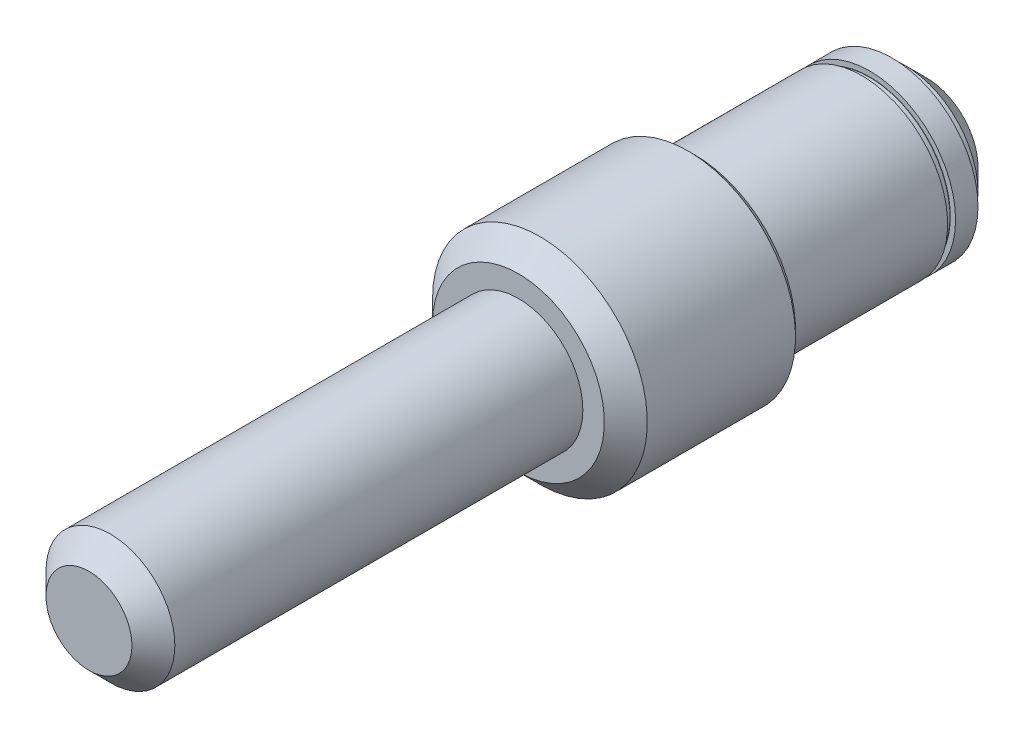
ISO-10303-21;
HEADER;
FILE_DESCRIPTION(('STEP AP214'),'2;1');
FILE_NAME('part.step','',(''),(''),'','','');
FILE_SCHEMA(('AUTOMOTIVE_DESIGN { 1 0 10303 214 1 1 1 1 }'));
ENDSEC;
DATA;
#1=APPLICATION_CONTEXT('core data for automotive mechanical design processes');
#2=APPLICATION_PROTOCOL_DEFINITION('international standard','automotive_design',2000,#1);
#3=PRODUCT_CONTEXT('',#1,'mechanical');
#4=PRODUCT('Part','Part','',(#3));
#5=PRODUCT_RELATED_PRODUCT_CATEGORY('part','',(#4));
#6=PRODUCT_DEFINITION_FORMATION('','',#4);
#7=PRODUCT_DEFINITION_CONTEXT('part definition',#1,'design');
#8=PRODUCT_DEFINITION('design','',#6,#7);
#9=PRODUCT_DEFINITION_SHAPE('','',#8);
#10=(LENGTH_UNIT() NAMED_UNIT(*) SI_UNIT(.MILLI.,.METRE.));
#11=(NAMED_UNIT(*) PLANE_ANGLE_UNIT() SI_UNIT($,.RADIAN.));
#12=(NAMED_UNIT(*) SI_UNIT($,.STERADIAN.) SOLID_ANGLE_UNIT());
#13=UNCERTAINTY_MEASURE_WITH_UNIT(LENGTH_MEASURE(1.E-05),#10,'distance_accuracy_value','');
#14=(GEOMETRIC_REPRESENTATION_CONTEXT(3) GLOBAL_UNCERTAINTY_ASSIGNED_CONTEXT((#13)) GLOBAL_UNIT_ASSIGNED_CONTEXT((#10,
#11,#12)) REPRESENTATION_CONTEXT('',''));
#15=CARTESIAN_POINT('',(0.,0.,0.));
#16=DIRECTION('',(0.,0.,1.));
#17=DIRECTION('',(1.,0.,0.));
#18=AXIS2_PLACEMENT_3D('',#15,#16,#17);
#19=CARTESIAN_POINT('',(0.,0.,0.));
#20=DIRECTION('',(0.,0.,1.));
#21=DIRECTION('',(1.,0.,0.));
#22=AXIS2_PLACEMENT_3D('',#19,#20,#21);
#23=CYLINDRICAL_SURFACE('',#22,20.);
#24=CARTESIAN_POINT('',(0.,0.,-179.925));
#25=DIRECTION('',(0.,0.,-1.));
#26=DIRECTION('',(-1.,0.,0.));
#27=AXIS2_PLACEMENT_3D('',#24,#25,#26);
#28=CIRCLE('',#27,20.);
#29=CARTESIAN_POINT('',(-20.,0.,-179.925));
#30=VERTEX_POINT('',#29);
#31=EDGE_CURVE('E214',#30,#30,#28,.T.);
#32=ORIENTED_EDGE('',*,*,#31,.F.);
#33=EDGE_LOOP('',(#32));
#34=FACE_BOUND('',#33,.T.);
#35=CARTESIAN_POINT('',(0.,0.,-141.));
#36=DIRECTION('',(0.,0.,-1.));
#37=DIRECTION('',(-1.,0.,0.));
#38=AXIS2_PLACEMENT_3D('',#35,#36,#37);
#39=CIRCLE('',#38,20.);
#40=CARTESIAN_POINT('',(-20.,0.,-141.));
#41=VERTEX_POINT('',#40);
#42=EDGE_CURVE('E212',#41,#41,#39,.T.);
#43=ORIENTED_EDGE('',*,*,#42,.T.);
#44=EDGE_LOOP('',(#43));
#45=FACE_BOUND('',#44,.T.);
#46=ADVANCED_FACE('F43',(#34,#45),#23,.T.);
#47=CARTESIAN_POINT('',(0.,0.,-179.925));
#48=DIRECTION('',(0.,0.,-1.));
#49=DIRECTION('',(-1.,0.,0.));
#50=AXIS2_PLACEMENT_3D('',#47,#48,#49);
#51=PLANE('',#50);
#52=CARTESIAN_POINT('',(0.,0.,-179.925));
#53=DIRECTION('',(0.,0.,-1.));
#54=DIRECTION('',(-1.,0.,0.));
#55=AXIS2_PLACEMENT_3D('',#52,#53,#54);
#56=CIRCLE('',#55,18.8);
#57=CARTESIAN_POINT('',(-18.8,0.,-179.925));
#58=VERTEX_POINT('',#57);
#59=EDGE_CURVE('E143',#58,#58,#56,.F.);
#60=ORIENTED_EDGE('',*,*,#59,.T.);
#61=EDGE_LOOP('',(#60));
#62=FACE_BOUND('',#61,.T.);
#63=ORIENTED_EDGE('',*,*,#31,.T.);
#64=EDGE_LOOP('',(#63));
#65=FACE_BOUND('',#64,.T.);
#66=ADVANCED_FACE('F75',(#62,#65),#51,.T.);
#67=CARTESIAN_POINT('',(0.,0.,-181.775));
#68=DIRECTION('',(0.,0.,-1.));
#69=DIRECTION('',(-1.,0.,0.));
#70=AXIS2_PLACEMENT_3D('',#67,#68,#69);
#71=PLANE('',#70);
#72=CARTESIAN_POINT('',(0.,0.,-181.775));
#73=DIRECTION('',(0.,0.,-1.));
#74=DIRECTION('',(-1.,0.,0.));
#75=AXIS2_PLACEMENT_3D('',#72,#73,#74);
#76=CIRCLE('',#75,18.8);
#77=CARTESIAN_POINT('',(-18.8,0.,-181.775));
#78=VERTEX_POINT('',#77);
#79=EDGE_CURVE('E147',#78,#78,#76,.T.);
#80=ORIENTED_EDGE('',*,*,#79,.T.);
#81=EDGE_LOOP('',(#80));
#82=FACE_BOUND('',#81,.T.);
#83=CARTESIAN_POINT('',(0.,0.,-181.775));
#84=DIRECTION('',(0.,0.,-1.));
#85=DIRECTION('',(-1.,0.,0.));
#86=AXIS2_PLACEMENT_3D('',#83,#84,#85);
#87=CIRCLE('',#86,20.);
#88=CARTESIAN_POINT('',(-20.,0.,-181.775));
#89=VERTEX_POINT('',#88);
#90=EDGE_CURVE('E108',#89,#89,#87,.T.);
#91=ORIENTED_EDGE('',*,*,#90,.F.);
#92=EDGE_LOOP('',(#91));
#93=FACE_BOUND('',#92,.T.);
#94=ADVANCED_FACE('F68',(#82,#93),#71,.F.);
#95=CARTESIAN_POINT('',(0.,0.,-179.925));
#96=DIRECTION('',(0.,0.,-1.));
#97=DIRECTION('',(-1.,0.,0.));
#98=AXIS2_PLACEMENT_3D('',#95,#96,#97);
#99=CYLINDRICAL_SURFACE('',#98,18.75);
#100=CARTESIAN_POINT('',(0.,0.,-179.975));
#101=DIRECTION('',(0.,0.,-1.));
#102=DIRECTION('',(-1.,0.,0.));
#103=AXIS2_PLACEMENT_3D('',#100,#101,#102);
#104=CIRCLE('',#103,18.75);
#105=CARTESIAN_POINT('',(-18.75,0.,-179.975));
#106=VERTEX_POINT('',#105);
#107=EDGE_CURVE('E141',#106,#106,#104,.T.);
#108=ORIENTED_EDGE('',*,*,#107,.T.);
#109=EDGE_LOOP('',(#108));
#110=FACE_BOUND('',#109,.T.);
#111=CARTESIAN_POINT('',(0.,0.,-181.725));
#112=DIRECTION('',(0.,0.,-1.));
#113=DIRECTION('',(-1.,0.,0.));
#114=AXIS2_PLACEMENT_3D('',#111,#112,#113);
#115=CIRCLE('',#114,18.75);
#116=CARTESIAN_POINT('',(-18.75,0.,-181.725));
#117=VERTEX_POINT('',#116);
#118=EDGE_CURVE('E137',#117,#117,#115,.F.);
#119=ORIENTED_EDGE('',*,*,#118,.T.);
#120=EDGE_LOOP('',(#119));
#121=FACE_BOUND('',#120,.T.);
#122=ADVANCED_FACE('F60',(#110,#121),#99,.T.);
#123=CARTESIAN_POINT('',(0.,0.,-190.));
#124=DIRECTION('',(0.,0.,-1.));
#125=DIRECTION('',(-1.,0.,0.));
#126=AXIS2_PLACEMENT_3D('',#123,#124,#125);
#127=CONICAL_SURFACE('',#126,0.,0.785398163397451);
#128=CARTESIAN_POINT('',(0.,0.,-195.));
#129=DIRECTION('',(0.,0.,1.));
#130=DIRECTION('',(1.,0.,0.));
#131=AXIS2_PLACEMENT_3D('',#128,#129,#130);
#132=CIRCLE('',#131,5.);
#133=CARTESIAN_POINT('',(5.,0.,-195.));
#134=VERTEX_POINT('',#133);
#135=EDGE_CURVE('E120',#134,#134,#132,.T.);
#136=ORIENTED_EDGE('',*,*,#135,.F.);
#137=EDGE_LOOP('',(#136));
#138=FACE_BOUND('',#137,.T.);
#139=CARTESIAN_POINT('',(0.,0.,-190.));
#140=VERTEX_POINT('',#139);
#141=VERTEX_LOOP('',#140);
#142=FACE_BOUND('',#141,.T.);
#143=ADVANCED_FACE('F53',(#138,#142),#127,.F.);
#144=CARTESIAN_POINT('',(0.,17.,-195.));
#145=DIRECTION('',(0.,0.,1.));
#146=DIRECTION('',(1.,0.,0.));
#147=AXIS2_PLACEMENT_3D('',#144,#145,#146);
#148=PLANE('',#147);
#149=CARTESIAN_POINT('',(0.,0.,-195.));
#150=DIRECTION('',(0.,0.,1.));
#151=DIRECTION('',(1.,0.,0.));
#152=AXIS2_PLACEMENT_3D('',#149,#150,#151);
#153=CIRCLE('',#152,12.);
#154=CARTESIAN_POINT('',(12.,0.,-195.));
#155=VERTEX_POINT('',#154);
#156=EDGE_CURVE('E133',#155,#155,#153,.F.);
#157=ORIENTED_EDGE('',*,*,#156,.T.);
#158=EDGE_LOOP('',(#157));
#159=FACE_BOUND('',#158,.T.);
#160=ORIENTED_EDGE('',*,*,#135,.T.);
#161=EDGE_LOOP('',(#160));
#162=FACE_BOUND('',#161,.T.);
#163=ADVANCED_FACE('F57',(#159,#162),#148,.F.);
#164=CARTESIAN_POINT('',(0.,0.,-190.));
#165=DIRECTION('',(0.,0.,1.));
#166=DIRECTION('',(1.,0.,0.));
#167=AXIS2_PLACEMENT_3D('',#164,#165,#166);
#168=CONICAL_SURFACE('',#167,17.,0.785398163397452);
#169=ORIENTED_EDGE('',*,*,#156,.F.);
#170=EDGE_LOOP('',(#169));
#171=FACE_BOUND('',#170,.T.);
#172=CARTESIAN_POINT('',(0.,0.,-190.));
#173=DIRECTION('',(0.,0.,1.));
#174=DIRECTION('',(1.,0.,0.));
#175=AXIS2_PLACEMENT_3D('',#172,#173,#174);
#176=CIRCLE('',#175,17.);
#177=CARTESIAN_POINT('',(17.,0.,-190.));
#178=VERTEX_POINT('',#177);
#179=EDGE_CURVE('E135',#178,#178,#176,.T.);
#180=ORIENTED_EDGE('',*,*,#179,.F.);
#181=EDGE_LOOP('',(#180));
#182=FACE_BOUND('',#181,.T.);
#183=ADVANCED_FACE('F61',(#171,#182),#168,.T.);
#184=CARTESIAN_POINT('',(0.,0.,0.));
#185=DIRECTION('',(0.,0.,1.));
#186=DIRECTION('',(1.,0.,0.));
#187=AXIS2_PLACEMENT_3D('',#184,#185,#186);
#188=CYLINDRICAL_SURFACE('',#187,17.);
#189=ORIENTED_EDGE('',*,*,#179,.T.);
#190=EDGE_LOOP('',(#189));
#191=FACE_BOUND('',#190,.T.);
#192=CARTESIAN_POINT('',(0.,0.,-187.));
#193=DIRECTION('',(0.,0.,1.));
#194=DIRECTION('',(1.,0.,0.));
#195=AXIS2_PLACEMENT_3D('',#192,#193,#194);
#196=CIRCLE('',#195,17.);
#197=CARTESIAN_POINT('',(17.,0.,-187.));
#198=VERTEX_POINT('',#197);
#199=EDGE_CURVE('E113',#198,#198,#196,.T.);
#200=ORIENTED_EDGE('',*,*,#199,.F.);
#201=EDGE_LOOP('',(#200));
#202=FACE_BOUND('',#201,.T.);
#203=ADVANCED_FACE('F102',(#191,#202),#188,.T.);
#204=CARTESIAN_POINT('',(0.,20.,-187.));
#205=DIRECTION('',(0.,0.,1.));
#206=DIRECTION('',(1.,0.,0.));
#207=AXIS2_PLACEMENT_3D('',#204,#205,#206);
#208=PLANE('',#207);
#209=CARTESIAN_POINT('',(0.,0.,-187.));
#210=DIRECTION('',(0.,0.,1.));
#211=DIRECTION('',(1.,0.,0.));
#212=AXIS2_PLACEMENT_3D('',#209,#210,#211);
#213=CIRCLE('',#212,20.);
#214=CARTESIAN_POINT('',(20.,0.,-187.));
#215=VERTEX_POINT('',#214);
#216=EDGE_CURVE('E110',#215,#215,#213,.T.);
#217=ORIENTED_EDGE('',*,*,#216,.F.);
#218=EDGE_LOOP('',(#217));
#219=FACE_BOUND('',#218,.T.);
#220=ORIENTED_EDGE('',*,*,#199,.T.);
#221=EDGE_LOOP('',(#220));
#222=FACE_BOUND('',#221,.T.);
#223=ADVANCED_FACE('F95',(#219,#222),#208,.F.);
#224=ORIENTED_EDGE('',*,*,#90,.T.);
#225=EDGE_LOOP('',(#224));
#226=FACE_BOUND('',#225,.T.);
#227=ORIENTED_EDGE('',*,*,#216,.T.);
#228=EDGE_LOOP('',(#227));
#229=FACE_BOUND('',#228,.T.);
#230=ADVANCED_FACE('F80',(#226,#229),#23,.T.);
#231=CARTESIAN_POINT('',(0.,0.,-179.975));
#232=DIRECTION('',(0.,0.,-1.));
#233=DIRECTION('',(-1.,0.,0.));
#234=AXIS2_PLACEMENT_3D('',#231,#232,#233);
#235=TOROIDAL_SURFACE('',#234,18.8,0.05);
#236=ORIENTED_EDGE('',*,*,#59,.F.);
#237=EDGE_LOOP('',(#236));
#238=FACE_BOUND('',#237,.T.);
#239=ORIENTED_EDGE('',*,*,#107,.F.);
#240=EDGE_LOOP('',(#239));
#241=FACE_BOUND('',#240,.T.);
#242=ADVANCED_FACE('F91',(#238,#241),#235,.F.);
#243=CARTESIAN_POINT('',(0.,0.,-181.725));
#244=DIRECTION('',(0.,0.,-1.));
#245=DIRECTION('',(-1.,0.,0.));
#246=AXIS2_PLACEMENT_3D('',#243,#244,#245);
#247=TOROIDAL_SURFACE('',#246,18.8,0.05);
#248=ORIENTED_EDGE('',*,*,#118,.F.);
#249=EDGE_LOOP('',(#248));
#250=FACE_BOUND('',#249,.T.);
#251=ORIENTED_EDGE('',*,*,#79,.F.);
#252=EDGE_LOOP('',(#251));
#253=FACE_BOUND('',#252,.T.);
#254=ADVANCED_FACE('F99',(#250,#253),#247,.F.);
#255=CARTESIAN_POINT('',(0.,0.,-141.));
#256=DIRECTION('',(0.,0.,-1.));
#257=DIRECTION('',(-1.,0.,0.));
#258=AXIS2_PLACEMENT_3D('',#255,#256,#257);
#259=PLANE('',#258);
#260=CARTESIAN_POINT('',(0.,0.,-141.));
#261=DIRECTION('',(0.,0.,-1.));
#262=DIRECTION('',(-1.,0.,0.));
#263=AXIS2_PLACEMENT_3D('',#260,#261,#262);
#264=CIRCLE('',#263,23.5);
#265=CARTESIAN_POINT('',(-23.5,0.,-141.));
#266=VERTEX_POINT('',#265);
#267=EDGE_CURVE('E51',#266,#266,#264,.T.);
#268=ORIENTED_EDGE('',*,*,#267,.T.);
#269=EDGE_LOOP('',(#268));
#270=FACE_BOUND('',#269,.T.);
#271=ORIENTED_EDGE('',*,*,#42,.F.);
#272=EDGE_LOOP('',(#271));
#273=FACE_BOUND('',#272,.T.);
#274=ADVANCED_FACE('F154',(#270,#273),#259,.T.);
#275=CARTESIAN_POINT('',(0.,0.,0.));
#276=DIRECTION('',(0.,0.,-1.));
#277=DIRECTION('',(-1.,0.,0.));
#278=AXIS2_PLACEMENT_3D('',#275,#276,#277);
#279=PLANE('',#278);
#280=CARTESIAN_POINT('',(0.,0.,0.));
#281=DIRECTION('',(0.,0.,-1.));
#282=DIRECTION('',(-1.,0.,0.));
#283=AXIS2_PLACEMENT_3D('',#280,#281,#282);
#284=CIRCLE('',#283,10.);
#285=CARTESIAN_POINT('',(-10.,0.,0.));
#286=VERTEX_POINT('',#285);
#287=EDGE_CURVE('E126',#286,#286,#284,.F.);
#288=ORIENTED_EDGE('',*,*,#287,.T.);
#289=EDGE_LOOP('',(#288));
#290=FACE_BOUND('',#289,.T.);
#291=ADVANCED_FACE('F188',(#290),#279,.F.);
#292=CARTESIAN_POINT('',(0.,0.,0.));
#293=DIRECTION('',(0.,0.,-1.));
#294=DIRECTION('',(-1.,0.,0.));
#295=AXIS2_PLACEMENT_3D('',#292,#293,#294);
#296=CONICAL_SURFACE('',#295,10.,0.785398163397446);
#297=CARTESIAN_POINT('',(0.,0.,-5.00000000000002));
#298=DIRECTION('',(0.,0.,-1.));
#299=DIRECTION('',(-1.,0.,0.));
#300=AXIS2_PLACEMENT_3D('',#297,#298,#299);
#301=CIRCLE('',#300,15.);
#302=CARTESIAN_POINT('',(-15.,0.,-5.00000000000002));
#303=VERTEX_POINT('',#302);
#304=EDGE_CURVE('E128',#303,#303,#301,.T.);
#305=ORIENTED_EDGE('',*,*,#304,.F.);
#306=EDGE_LOOP('',(#305));
#307=FACE_BOUND('',#306,.T.);
#308=ORIENTED_EDGE('',*,*,#287,.F.);
#309=EDGE_LOOP('',(#308));
#310=FACE_BOUND('',#309,.T.);
#311=ADVANCED_FACE('F178',(#307,#310),#296,.T.);
#312=CARTESIAN_POINT('',(0.,0.,0.));
#313=DIRECTION('',(0.,0.,1.));
#314=DIRECTION('',(1.,0.,0.));
#315=AXIS2_PLACEMENT_3D('',#312,#313,#314);
#316=CYLINDRICAL_SURFACE('',#315,15.);
#317=ORIENTED_EDGE('',*,*,#304,.T.);
#318=EDGE_LOOP('',(#317));
#319=FACE_BOUND('',#318,.T.);
#320=CARTESIAN_POINT('',(0.,0.,-100.));
#321=DIRECTION('',(0.,0.,1.));
#322=DIRECTION('',(1.,0.,0.));
#323=AXIS2_PLACEMENT_3D('',#320,#321,#322);
#324=CIRCLE('',#323,15.);
#325=CARTESIAN_POINT('',(15.,0.,-100.));
#326=VERTEX_POINT('',#325);
#327=EDGE_CURVE('E109',#326,#326,#324,.T.);
#328=ORIENTED_EDGE('',*,*,#327,.T.);
#329=EDGE_LOOP('',(#328));
#330=FACE_BOUND('',#329,.T.);
#331=ADVANCED_FACE('F175',(#319,#330),#316,.T.);
#332=CARTESIAN_POINT('',(0.,15.,-100.));
#333=DIRECTION('',(0.,0.,-1.));
#334=DIRECTION('',(-1.,0.,0.));
#335=AXIS2_PLACEMENT_3D('',#332,#333,#334);
#336=PLANE('',#335);
#337=CARTESIAN_POINT('',(0.,0.,-100.));
#338=DIRECTION('',(0.,0.,-1.));
#339=DIRECTION('',(-1.,0.,0.));
#340=AXIS2_PLACEMENT_3D('',#337,#338,#339);
#341=CIRCLE('',#340,20.);
#342=CARTESIAN_POINT('',(-20.,0.,-100.));
#343=VERTEX_POINT('',#342);
#344=EDGE_CURVE('E114',#343,#343,#341,.F.);
#345=ORIENTED_EDGE('',*,*,#344,.T.);
#346=EDGE_LOOP('',(#345));
#347=FACE_BOUND('',#346,.T.);
#348=ORIENTED_EDGE('',*,*,#327,.F.);
#349=EDGE_LOOP('',(#348));
#350=FACE_BOUND('',#349,.T.);
#351=ADVANCED_FACE('F168',(#347,#350),#336,.F.);
#352=CARTESIAN_POINT('',(0.,0.,-100.));
#353=DIRECTION('',(0.,0.,-1.));
#354=DIRECTION('',(-1.,0.,0.));
#355=AXIS2_PLACEMENT_3D('',#352,#353,#354);
#356=CONICAL_SURFACE('',#355,20.,0.785398163397445);
#357=CARTESIAN_POINT('',(0.,0.,-105.));
#358=DIRECTION('',(0.,0.,-1.));
#359=DIRECTION('',(-1.,0.,0.));
#360=AXIS2_PLACEMENT_3D('',#357,#358,#359);
#361=CIRCLE('',#360,25.);
#362=CARTESIAN_POINT('',(-25.,0.,-105.));
#363=VERTEX_POINT('',#362);
#364=EDGE_CURVE('E123',#363,#363,#361,.T.);
#365=ORIENTED_EDGE('',*,*,#364,.F.);
#366=EDGE_LOOP('',(#365));
#367=FACE_BOUND('',#366,.T.);
#368=ORIENTED_EDGE('',*,*,#344,.F.);
#369=EDGE_LOOP('',(#368));
#370=FACE_BOUND('',#369,.T.);
#371=ADVANCED_FACE('F163',(#367,#370),#356,.T.);
#372=CARTESIAN_POINT('',(0.,0.,0.));
#373=DIRECTION('',(0.,0.,1.));
#374=DIRECTION('',(1.,0.,0.));
#375=AXIS2_PLACEMENT_3D('',#372,#373,#374);
#376=CYLINDRICAL_SURFACE('',#375,25.);
#377=CARTESIAN_POINT('',(0.,0.,-139.5));
#378=DIRECTION('',(0.,0.,-1.));
#379=DIRECTION('',(-1.,0.,0.));
#380=AXIS2_PLACEMENT_3D('',#377,#378,#379);
#381=CIRCLE('',#380,25.);
#382=CARTESIAN_POINT('',(-25.,0.,-139.5));
#383=VERTEX_POINT('',#382);
#384=EDGE_CURVE('E11',#383,#383,#381,.F.);
#385=ORIENTED_EDGE('',*,*,#384,.T.);
#386=EDGE_LOOP('',(#385));
#387=FACE_BOUND('',#386,.T.);
#388=ORIENTED_EDGE('',*,*,#364,.T.);
#389=EDGE_LOOP('',(#388));
#390=FACE_BOUND('',#389,.T.);
#391=ADVANCED_FACE('F157',(#387,#390),#376,.T.);
#392=CARTESIAN_POINT('',(0.,0.,-141.));
#393=DIRECTION('',(0.,0.,1.));
#394=DIRECTION('',(1.,0.,0.));
#395=AXIS2_PLACEMENT_3D('',#392,#393,#394);
#396=CONICAL_SURFACE('',#395,23.5,0.78539816339745);
#397=ORIENTED_EDGE('',*,*,#384,.F.);
#398=EDGE_LOOP('',(#397));
#399=FACE_BOUND('',#398,.T.);
#400=ORIENTED_EDGE('',*,*,#267,.F.);
#401=EDGE_LOOP('',(#400));
#402=FACE_BOUND('',#401,.T.);
#403=ADVANCED_FACE('F46',(#399,#402),#396,.T.);
#404=CLOSED_SHELL('',(#46,#66,#94,#122,#143,#163,#183,#203,#223,#230,#242,#254,#274,#291,#311,
#331,#351,#371,#391,#403));
#405=MANIFOLD_SOLID_BREP('B2',#404);
#406=ADVANCED_BREP_SHAPE_REPRESENTATION('',(#18,#405),#14);
#407=SHAPE_DEFINITION_REPRESENTATION(#9,#406);
ENDSEC;
END-ISO-10303-21;
